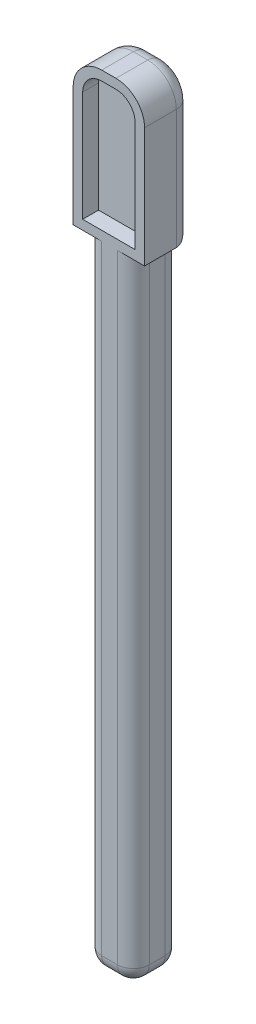
ISO-10303-21;
HEADER;
FILE_DESCRIPTION(('STEP AP214'),'2;1');
FILE_NAME('part.step','',(''),(''),'','','');
FILE_SCHEMA(('AUTOMOTIVE_DESIGN { 1 0 10303 214 1 1 1 1 }'));
ENDSEC;
DATA;
#1=APPLICATION_CONTEXT('core data for automotive mechanical design processes');
#2=APPLICATION_PROTOCOL_DEFINITION('international standard','automotive_design',2000,#1);
#3=PRODUCT_CONTEXT('',#1,'mechanical');
#4=PRODUCT('Part','Part','',(#3));
#5=PRODUCT_RELATED_PRODUCT_CATEGORY('part','',(#4));
#6=PRODUCT_DEFINITION_FORMATION('','',#4);
#7=PRODUCT_DEFINITION_CONTEXT('part definition',#1,'design');
#8=PRODUCT_DEFINITION('design','',#6,#7);
#9=PRODUCT_DEFINITION_SHAPE('','',#8);
#10=(LENGTH_UNIT() NAMED_UNIT(*) SI_UNIT(.MILLI.,.METRE.));
#11=(NAMED_UNIT(*) PLANE_ANGLE_UNIT() SI_UNIT($,.RADIAN.));
#12=(NAMED_UNIT(*) SI_UNIT($,.STERADIAN.) SOLID_ANGLE_UNIT());
#13=UNCERTAINTY_MEASURE_WITH_UNIT(LENGTH_MEASURE(1.E-05),#10,'distance_accuracy_value','');
#14=(GEOMETRIC_REPRESENTATION_CONTEXT(3) GLOBAL_UNCERTAINTY_ASSIGNED_CONTEXT((#13)) GLOBAL_UNIT_ASSIGNED_CONTEXT((#10,
#11,#12)) REPRESENTATION_CONTEXT('',''));
#15=CARTESIAN_POINT('',(0.,0.,0.));
#16=DIRECTION('',(0.,0.,1.));
#17=DIRECTION('',(1.,0.,0.));
#18=AXIS2_PLACEMENT_3D('',#15,#16,#17);
#19=CARTESIAN_POINT('',(0.,0.,3.));
#20=DIRECTION('',(1.,0.,0.));
#21=DIRECTION('',(0.,0.,-1.));
#22=AXIS2_PLACEMENT_3D('',#19,#20,#21);
#23=PLANE('',#22);
#24=DIRECTION('',(0.,0.,-1.));
#25=VECTOR('',#24,1.);
#26=CARTESIAN_POINT('',(0.,0.999999999999999,3.));
#27=LINE('',#26,#25);
#28=CARTESIAN_POINT('',(0.,0.999999999999999,0.999999999999999));
#29=VERTEX_POINT('',#28);
#30=CARTESIAN_POINT('',(0.,0.999999999999999,2.));
#31=VERTEX_POINT('',#30);
#32=EDGE_CURVE('E317',#29,#31,#27,.F.);
#33=ORIENTED_EDGE('',*,*,#32,.T.);
#34=DIRECTION('',(0.,-1.,0.));
#35=VECTOR('',#34,1.);
#36=CARTESIAN_POINT('',(0.,40.,2.));
#37=LINE('',#36,#35);
#38=CARTESIAN_POINT('',(0.,40.,2.));
#39=VERTEX_POINT('',#38);
#40=EDGE_CURVE('E319',#31,#39,#37,.F.);
#41=ORIENTED_EDGE('',*,*,#40,.T.);
#42=DIRECTION('',(0.,0.,-1.));
#43=VECTOR('',#42,1.);
#44=CARTESIAN_POINT('',(0.,40.,3.));
#45=LINE('',#44,#43);
#46=CARTESIAN_POINT('',(0.,40.,0.999999999999999));
#47=VERTEX_POINT('',#46);
#48=EDGE_CURVE('E278',#39,#47,#45,.T.);
#49=ORIENTED_EDGE('',*,*,#48,.T.);
#50=DIRECTION('',(0.,-1.,0.));
#51=VECTOR('',#50,1.);
#52=CARTESIAN_POINT('',(0.,0.,0.999999999999999));
#53=LINE('',#52,#51);
#54=EDGE_CURVE('E315',#47,#29,#53,.T.);
#55=ORIENTED_EDGE('',*,*,#54,.T.);
#56=EDGE_LOOP('',(#33,#41,#49,#55));
#57=FACE_BOUND('',#56,.T.);
#58=ADVANCED_FACE('F35',(#57),#23,.F.);
#59=CARTESIAN_POINT('',(0.,0.,3.));
#60=DIRECTION('',(0.,1.,0.));
#61=DIRECTION('',(0.,0.,1.));
#62=AXIS2_PLACEMENT_3D('',#59,#60,#61);
#63=PLANE('',#62);
#64=DIRECTION('',(0.,0.,-1.));
#65=VECTOR('',#64,1.);
#66=CARTESIAN_POINT('',(2.,0.,3.));
#67=LINE('',#66,#65);
#68=CARTESIAN_POINT('',(2.,0.,0.999999999999999));
#69=VERTEX_POINT('',#68);
#70=CARTESIAN_POINT('',(2.,0.,2.));
#71=VERTEX_POINT('',#70);
#72=EDGE_CURVE('E310',#69,#71,#67,.F.);
#73=ORIENTED_EDGE('',*,*,#72,.T.);
#74=DIRECTION('',(1.,0.,0.));
#75=VECTOR('',#74,1.);
#76=CARTESIAN_POINT('',(0.,0.,2.));
#77=LINE('',#76,#75);
#78=CARTESIAN_POINT('',(0.999999999999999,0.,2.));
#79=VERTEX_POINT('',#78);
#80=EDGE_CURVE('E313',#71,#79,#77,.F.);
#81=ORIENTED_EDGE('',*,*,#80,.T.);
#82=DIRECTION('',(0.,0.,-1.));
#83=VECTOR('',#82,1.);
#84=CARTESIAN_POINT('',(0.999999999999999,0.,3.));
#85=LINE('',#84,#83);
#86=CARTESIAN_POINT('',(0.999999999999999,0.,0.999999999999999));
#87=VERTEX_POINT('',#86);
#88=EDGE_CURVE('E308',#79,#87,#85,.T.);
#89=ORIENTED_EDGE('',*,*,#88,.T.);
#90=DIRECTION('',(1.,0.,0.));
#91=VECTOR('',#90,1.);
#92=CARTESIAN_POINT('',(0.,0.,0.999999999999999));
#93=LINE('',#92,#91);
#94=EDGE_CURVE('E306',#87,#69,#93,.T.);
#95=ORIENTED_EDGE('',*,*,#94,.T.);
#96=EDGE_LOOP('',(#73,#81,#89,#95));
#97=FACE_BOUND('',#96,.T.);
#98=ADVANCED_FACE('F524',(#97),#63,.F.);
#99=CARTESIAN_POINT('',(3.,0.,3.));
#100=DIRECTION('',(-1.,0.,0.));
#101=DIRECTION('',(0.,0.,1.));
#102=AXIS2_PLACEMENT_3D('',#99,#100,#101);
#103=PLANE('',#102);
#104=DIRECTION('',(0.,0.,-1.));
#105=VECTOR('',#104,1.);
#106=CARTESIAN_POINT('',(3.,40.,3.));
#107=LINE('',#106,#105);
#108=CARTESIAN_POINT('',(3.,40.,2.));
#109=VERTEX_POINT('',#108);
#110=CARTESIAN_POINT('',(3.,40.,0.999999999999999));
#111=VERTEX_POINT('',#110);
#112=EDGE_CURVE('E296',#109,#111,#107,.T.);
#113=ORIENTED_EDGE('',*,*,#112,.F.);
#114=DIRECTION('',(0.,1.,0.));
#115=VECTOR('',#114,1.);
#116=CARTESIAN_POINT('',(3.,0.,2.));
#117=LINE('',#116,#115);
#118=CARTESIAN_POINT('',(3.,0.999999999999999,2.));
#119=VERTEX_POINT('',#118);
#120=EDGE_CURVE('E304',#109,#119,#117,.F.);
#121=ORIENTED_EDGE('',*,*,#120,.T.);
#122=DIRECTION('',(0.,0.,-1.));
#123=VECTOR('',#122,1.);
#124=CARTESIAN_POINT('',(3.,0.999999999999999,3.));
#125=LINE('',#124,#123);
#126=CARTESIAN_POINT('',(3.,0.999999999999999,0.999999999999999));
#127=VERTEX_POINT('',#126);
#128=EDGE_CURVE('E301',#119,#127,#125,.T.);
#129=ORIENTED_EDGE('',*,*,#128,.T.);
#130=DIRECTION('',(0.,1.,0.));
#131=VECTOR('',#130,1.);
#132=CARTESIAN_POINT('',(3.,0.,0.999999999999999));
#133=LINE('',#132,#131);
#134=EDGE_CURVE('E299',#127,#111,#133,.T.);
#135=ORIENTED_EDGE('',*,*,#134,.T.);
#136=EDGE_LOOP('',(#113,#121,#129,#135));
#137=FACE_BOUND('',#136,.T.);
#138=ADVANCED_FACE('F505',(#137),#103,.F.);
#139=CARTESIAN_POINT('',(3.,40.,3.));
#140=DIRECTION('',(0.,1.,0.));
#141=DIRECTION('',(0.,0.,1.));
#142=AXIS2_PLACEMENT_3D('',#139,#140,#141);
#143=PLANE('',#142);
#144=ORIENTED_EDGE('',*,*,#112,.T.);
#145=DIRECTION('',(1.,0.,0.));
#146=VECTOR('',#145,1.);
#147=CARTESIAN_POINT('',(3.,40.,0.999999999999999));
#148=LINE('',#147,#146);
#149=CARTESIAN_POINT('',(3.70308990164131,40.,0.999999999999999));
#150=VERTEX_POINT('',#149);
#151=EDGE_CURVE('E349',#111,#150,#148,.T.);
#152=ORIENTED_EDGE('',*,*,#151,.T.);
#153=DIRECTION('',(0.,0.,-1.));
#154=VECTOR('',#153,1.);
#155=CARTESIAN_POINT('',(3.70308990164131,40.,3.));
#156=LINE('',#155,#154);
#157=CARTESIAN_POINT('',(3.70308990164131,40.,3.));
#158=VERTEX_POINT('',#157);
#159=EDGE_CURVE('E294',#158,#150,#156,.T.);
#160=ORIENTED_EDGE('',*,*,#159,.F.);
#161=DIRECTION('',(1.,0.,0.));
#162=VECTOR('',#161,1.);
#163=CARTESIAN_POINT('',(3.,40.,3.));
#164=LINE('',#163,#162);
#165=CARTESIAN_POINT('',(2.,40.,3.));
#166=VERTEX_POINT('',#165);
#167=EDGE_CURVE('E257',#166,#158,#164,.T.);
#168=ORIENTED_EDGE('',*,*,#167,.F.);
#169=CARTESIAN_POINT('',(2.,40.,2.));
#170=DIRECTION('',(0.,1.,0.));
#171=DIRECTION('',(0.,0.,1.));
#172=AXIS2_PLACEMENT_3D('',#169,#170,#171);
#173=CIRCLE('',#172,0.999999999999999);
#174=EDGE_CURVE('E11',#166,#109,#173,.T.);
#175=ORIENTED_EDGE('',*,*,#174,.T.);
#176=EDGE_LOOP('',(#144,#152,#160,#168,#175));
#177=FACE_BOUND('',#176,.T.);
#178=ADVANCED_FACE('F501',(#177),#143,.F.);
#179=CARTESIAN_POINT('',(3.70308990164131,40.,3.));
#180=DIRECTION('',(-1.,0.,0.));
#181=DIRECTION('',(0.,0.,1.));
#182=AXIS2_PLACEMENT_3D('',#179,#180,#181);
#183=PLANE('',#182);
#184=ORIENTED_EDGE('',*,*,#159,.T.);
#185=DIRECTION('',(0.,1.,0.));
#186=VECTOR('',#185,1.);
#187=CARTESIAN_POINT('',(3.70308990164131,40.,0.999999999999999));
#188=LINE('',#187,#186);
#189=CARTESIAN_POINT('',(3.70308990164131,47.5461538461538,0.999999999999999));
#190=VERTEX_POINT('',#189);
#191=EDGE_CURVE('E52',#150,#190,#188,.T.);
#192=ORIENTED_EDGE('',*,*,#191,.T.);
#193=DIRECTION('',(0.,0.,-1.));
#194=VECTOR('',#193,1.);
#195=CARTESIAN_POINT('',(3.70308990164131,47.5461538461538,3.));
#196=LINE('',#195,#194);
#197=CARTESIAN_POINT('',(3.70308990164131,47.5461538461538,3.));
#198=VERTEX_POINT('',#197);
#199=EDGE_CURVE('E292',#198,#190,#196,.T.);
#200=ORIENTED_EDGE('',*,*,#199,.F.);
#201=DIRECTION('',(0.,1.,0.));
#202=VECTOR('',#201,1.);
#203=CARTESIAN_POINT('',(3.70308990164131,40.,3.));
#204=LINE('',#203,#202);
#205=EDGE_CURVE('E266',#158,#198,#204,.T.);
#206=ORIENTED_EDGE('',*,*,#205,.F.);
#207=EDGE_LOOP('',(#184,#192,#200,#206));
#208=FACE_BOUND('',#207,.T.);
#209=ADVANCED_FACE('F514',(#208),#183,.F.);
#210=CARTESIAN_POINT('',(1.90308990164131,47.5461538461538,3.));
#211=DIRECTION('',(0.,0.,-1.));
#212=DIRECTION('',(-1.,0.,0.));
#213=AXIS2_PLACEMENT_3D('',#210,#211,#212);
#214=CYLINDRICAL_SURFACE('',#213,1.8);
#215=ORIENTED_EDGE('',*,*,#199,.T.);
#216=CARTESIAN_POINT('',(1.90308990164131,47.5461538461538,0.999999999999999));
#217=DIRECTION('',(0.,0.,1.));
#218=DIRECTION('',(1.,0.,0.));
#219=AXIS2_PLACEMENT_3D('',#216,#217,#218);
#220=CIRCLE('',#219,1.8);
#221=CARTESIAN_POINT('',(1.90308990164131,49.3461538461538,0.999999999999999));
#222=VERTEX_POINT('',#221);
#223=EDGE_CURVE('E59',#190,#222,#220,.T.);
#224=ORIENTED_EDGE('',*,*,#223,.T.);
#225=DIRECTION('',(0.,0.,-1.));
#226=VECTOR('',#225,1.);
#227=CARTESIAN_POINT('',(1.90308990164131,49.3461538461538,3.));
#228=LINE('',#227,#226);
#229=CARTESIAN_POINT('',(1.90308990164131,49.3461538461538,3.));
#230=VERTEX_POINT('',#229);
#231=EDGE_CURVE('E290',#230,#222,#228,.T.);
#232=ORIENTED_EDGE('',*,*,#231,.F.);
#233=CARTESIAN_POINT('',(1.90308990164131,47.5461538461538,3.));
#234=DIRECTION('',(0.,0.,1.));
#235=DIRECTION('',(-1.,0.,0.));
#236=AXIS2_PLACEMENT_3D('',#233,#234,#235);
#237=CIRCLE('',#236,1.8);
#238=EDGE_CURVE('E268',#198,#230,#237,.T.);
#239=ORIENTED_EDGE('',*,*,#238,.F.);
#240=EDGE_LOOP('',(#215,#224,#232,#239));
#241=FACE_BOUND('',#240,.T.);
#242=ADVANCED_FACE('F445',(#241),#214,.T.);
#243=CARTESIAN_POINT('',(1.00308990164131,49.3461538461538,3.));
#244=DIRECTION('',(0.,-1.,0.));
#245=DIRECTION('',(0.,0.,-1.));
#246=AXIS2_PLACEMENT_3D('',#243,#244,#245);
#247=PLANE('',#246);
#248=ORIENTED_EDGE('',*,*,#231,.T.);
#249=DIRECTION('',(-1.,0.,0.));
#250=VECTOR('',#249,1.);
#251=CARTESIAN_POINT('',(1.00308990164131,49.3461538461538,0.999999999999999));
#252=LINE('',#251,#250);
#253=CARTESIAN_POINT('',(1.00308990164131,49.3461538461538,0.999999999999999));
#254=VERTEX_POINT('',#253);
#255=EDGE_CURVE('E355',#222,#254,#252,.T.);
#256=ORIENTED_EDGE('',*,*,#255,.T.);
#257=DIRECTION('',(0.,0.,-1.));
#258=VECTOR('',#257,1.);
#259=CARTESIAN_POINT('',(1.00308990164131,49.3461538461538,3.));
#260=LINE('',#259,#258);
#261=CARTESIAN_POINT('',(1.00308990164131,49.3461538461538,3.));
#262=VERTEX_POINT('',#261);
#263=EDGE_CURVE('E287',#262,#254,#260,.T.);
#264=ORIENTED_EDGE('',*,*,#263,.F.);
#265=DIRECTION('',(-1.,0.,0.));
#266=VECTOR('',#265,1.);
#267=CARTESIAN_POINT('',(1.00308990164131,49.3461538461538,3.));
#268=LINE('',#267,#266);
#269=EDGE_CURVE('E270',#230,#262,#268,.T.);
#270=ORIENTED_EDGE('',*,*,#269,.F.);
#271=EDGE_LOOP('',(#248,#256,#264,#270));
#272=FACE_BOUND('',#271,.T.);
#273=ADVANCED_FACE('F444',(#272),#247,.F.);
#274=CARTESIAN_POINT('',(1.00308990164131,47.5461538461538,3.));
#275=DIRECTION('',(0.,0.,-1.));
#276=DIRECTION('',(-1.,0.,0.));
#277=AXIS2_PLACEMENT_3D('',#274,#275,#276);
#278=CYLINDRICAL_SURFACE('',#277,1.8);
#279=ORIENTED_EDGE('',*,*,#263,.T.);
#280=CARTESIAN_POINT('',(1.00308990164131,47.5461538461538,0.999999999999999));
#281=DIRECTION('',(0.,0.,1.));
#282=DIRECTION('',(1.,0.,0.));
#283=AXIS2_PLACEMENT_3D('',#280,#281,#282);
#284=CIRCLE('',#283,1.8);
#285=CARTESIAN_POINT('',(-0.796910098358696,47.5461538461538,0.999999999999999));
#286=VERTEX_POINT('',#285);
#287=EDGE_CURVE('E357',#254,#286,#284,.T.);
#288=ORIENTED_EDGE('',*,*,#287,.T.);
#289=DIRECTION('',(0.,0.,-1.));
#290=VECTOR('',#289,1.);
#291=CARTESIAN_POINT('',(-0.796910098358696,47.5461538461538,3.));
#292=LINE('',#291,#290);
#293=CARTESIAN_POINT('',(-0.796910098358696,47.5461538461538,3.));
#294=VERTEX_POINT('',#293);
#295=EDGE_CURVE('E284',#294,#286,#292,.T.);
#296=ORIENTED_EDGE('',*,*,#295,.F.);
#297=CARTESIAN_POINT('',(1.00308990164131,47.5461538461538,3.));
#298=DIRECTION('',(0.,0.,1.));
#299=DIRECTION('',(1.,0.,0.));
#300=AXIS2_PLACEMENT_3D('',#297,#298,#299);
#301=CIRCLE('',#300,1.8);
#302=EDGE_CURVE('E272',#262,#294,#301,.T.);
#303=ORIENTED_EDGE('',*,*,#302,.F.);
#304=EDGE_LOOP('',(#279,#288,#296,#303));
#305=FACE_BOUND('',#304,.T.);
#306=ADVANCED_FACE('F431',(#305),#278,.T.);
#307=CARTESIAN_POINT('',(-0.796910098358694,40.,3.));
#308=DIRECTION('',(1.,0.,0.));
#309=DIRECTION('',(0.,0.,-1.));
#310=AXIS2_PLACEMENT_3D('',#307,#308,#309);
#311=PLANE('',#310);
#312=ORIENTED_EDGE('',*,*,#295,.T.);
#313=DIRECTION('',(0.,-1.,0.));
#314=VECTOR('',#313,1.);
#315=CARTESIAN_POINT('',(-0.796910098358694,40.,0.999999999999999));
#316=LINE('',#315,#314);
#317=CARTESIAN_POINT('',(-0.796910098358694,40.,0.999999999999999));
#318=VERTEX_POINT('',#317);
#319=EDGE_CURVE('E353',#286,#318,#316,.T.);
#320=ORIENTED_EDGE('',*,*,#319,.T.);
#321=DIRECTION('',(0.,0.,-1.));
#322=VECTOR('',#321,1.);
#323=CARTESIAN_POINT('',(-0.796910098358694,40.,3.));
#324=LINE('',#323,#322);
#325=CARTESIAN_POINT('',(-0.796910098358694,40.,3.));
#326=VERTEX_POINT('',#325);
#327=EDGE_CURVE('E281',#326,#318,#324,.T.);
#328=ORIENTED_EDGE('',*,*,#327,.F.);
#329=DIRECTION('',(0.,-1.,0.));
#330=VECTOR('',#329,1.);
#331=CARTESIAN_POINT('',(-0.796910098358694,40.,3.));
#332=LINE('',#331,#330);
#333=EDGE_CURVE('E274',#294,#326,#332,.T.);
#334=ORIENTED_EDGE('',*,*,#333,.F.);
#335=EDGE_LOOP('',(#312,#320,#328,#334));
#336=FACE_BOUND('',#335,.T.);
#337=ADVANCED_FACE('F436',(#336),#311,.F.);
#338=CARTESIAN_POINT('',(-0.796910098358694,40.,3.));
#339=DIRECTION('',(0.,1.,0.));
#340=DIRECTION('',(0.,0.,1.));
#341=AXIS2_PLACEMENT_3D('',#338,#339,#340);
#342=PLANE('',#341);
#343=ORIENTED_EDGE('',*,*,#327,.T.);
#344=DIRECTION('',(1.,0.,0.));
#345=VECTOR('',#344,1.);
#346=CARTESIAN_POINT('',(-0.796910098358694,40.,0.999999999999999));
#347=LINE('',#346,#345);
#348=EDGE_CURVE('E351',#318,#47,#347,.T.);
#349=ORIENTED_EDGE('',*,*,#348,.T.);
#350=ORIENTED_EDGE('',*,*,#48,.F.);
#351=CARTESIAN_POINT('',(0.999999999999999,40.,2.));
#352=DIRECTION('',(0.,1.,0.));
#353=DIRECTION('',(0.,0.,1.));
#354=AXIS2_PLACEMENT_3D('',#351,#352,#353);
#355=CIRCLE('',#354,0.999999999999999);
#356=CARTESIAN_POINT('',(0.999999999999999,40.,3.));
#357=VERTEX_POINT('',#356);
#358=EDGE_CURVE('E44',#39,#357,#355,.T.);
#359=ORIENTED_EDGE('',*,*,#358,.T.);
#360=DIRECTION('',(1.,0.,0.));
#361=VECTOR('',#360,1.);
#362=CARTESIAN_POINT('',(-0.796910098358694,40.,3.));
#363=LINE('',#362,#361);
#364=EDGE_CURVE('E276',#326,#357,#363,.T.);
#365=ORIENTED_EDGE('',*,*,#364,.F.);
#366=EDGE_LOOP('',(#343,#349,#350,#359,#365));
#367=FACE_BOUND('',#366,.T.);
#368=ADVANCED_FACE('F469',(#367),#342,.F.);
#369=CARTESIAN_POINT('',(1.00308990164131,47.5461538461538,3.));
#370=DIRECTION('',(0.,0.,1.));
#371=DIRECTION('',(1.,0.,0.));
#372=AXIS2_PLACEMENT_3D('',#369,#370,#371);
#373=PLANE('',#372);
#374=DIRECTION('',(1.,0.,0.));
#375=VECTOR('',#374,1.);
#376=CARTESIAN_POINT('',(-0.196910098358695,40.6,3.));
#377=LINE('',#376,#375);
#378=CARTESIAN_POINT('',(-0.196910098358695,40.6,3.));
#379=VERTEX_POINT('',#378);
#380=CARTESIAN_POINT('',(3.10308990164131,40.6,3.));
#381=VERTEX_POINT('',#380);
#382=EDGE_CURVE('E213',#379,#381,#377,.T.);
#383=ORIENTED_EDGE('',*,*,#382,.F.);
#384=DIRECTION('',(0.,-1.,0.));
#385=VECTOR('',#384,1.);
#386=CARTESIAN_POINT('',(-0.196910098358696,47.5461538461538,3.));
#387=LINE('',#386,#385);
#388=CARTESIAN_POINT('',(-0.196910098358695,47.5461538461538,3.));
#389=VERTEX_POINT('',#388);
#390=EDGE_CURVE('E231',#389,#379,#387,.T.);
#391=ORIENTED_EDGE('',*,*,#390,.F.);
#392=CARTESIAN_POINT('',(1.00308990164131,47.5461538461538,3.));
#393=DIRECTION('',(0.,0.,1.));
#394=DIRECTION('',(1.,0.,0.));
#395=AXIS2_PLACEMENT_3D('',#392,#393,#394);
#396=CIRCLE('',#395,1.2);
#397=CARTESIAN_POINT('',(1.00308990164131,48.7461538461538,3.));
#398=VERTEX_POINT('',#397);
#399=EDGE_CURVE('E234',#398,#389,#396,.T.);
#400=ORIENTED_EDGE('',*,*,#399,.F.);
#401=DIRECTION('',(-1.,0.,0.));
#402=VECTOR('',#401,1.);
#403=CARTESIAN_POINT('',(1.90308990164131,48.7461538461538,3.));
#404=LINE('',#403,#402);
#405=CARTESIAN_POINT('',(1.90308990164131,48.7461538461538,3.));
#406=VERTEX_POINT('',#405);
#407=EDGE_CURVE('E250',#406,#398,#404,.T.);
#408=ORIENTED_EDGE('',*,*,#407,.F.);
#409=CARTESIAN_POINT('',(1.90308990164131,47.5461538461538,3.));
#410=DIRECTION('',(0.,0.,1.));
#411=DIRECTION('',(1.,0.,0.));
#412=AXIS2_PLACEMENT_3D('',#409,#410,#411);
#413=CIRCLE('',#412,1.2);
#414=CARTESIAN_POINT('',(3.10308990164131,47.5461538461538,3.));
#415=VERTEX_POINT('',#414);
#416=EDGE_CURVE('E247',#415,#406,#413,.T.);
#417=ORIENTED_EDGE('',*,*,#416,.F.);
#418=DIRECTION('',(0.,1.,0.));
#419=VECTOR('',#418,1.);
#420=CARTESIAN_POINT('',(3.10308990164131,40.6,3.));
#421=LINE('',#420,#419);
#422=EDGE_CURVE('E245',#381,#415,#421,.T.);
#423=ORIENTED_EDGE('',*,*,#422,.F.);
#424=EDGE_LOOP('',(#383,#391,#400,#408,#417,#423));
#425=FACE_BOUND('',#424,.T.);
#426=ORIENTED_EDGE('',*,*,#364,.T.);
#427=DIRECTION('',(0.,-1.,0.));
#428=VECTOR('',#427,1.);
#429=CARTESIAN_POINT('',(0.999999999999999,0.,3.));
#430=LINE('',#429,#428);
#431=CARTESIAN_POINT('',(0.999999999999999,1.,3.));
#432=VERTEX_POINT('',#431);
#433=EDGE_CURVE('E326',#357,#432,#430,.T.);
#434=ORIENTED_EDGE('',*,*,#433,.T.);
#435=DIRECTION('',(1.,0.,0.));
#436=VECTOR('',#435,1.);
#437=CARTESIAN_POINT('',(3.,1.,3.));
#438=LINE('',#437,#436);
#439=CARTESIAN_POINT('',(2.,1.,3.));
#440=VERTEX_POINT('',#439);
#441=EDGE_CURVE('E324',#432,#440,#438,.T.);
#442=ORIENTED_EDGE('',*,*,#441,.T.);
#443=DIRECTION('',(0.,1.,0.));
#444=VECTOR('',#443,1.);
#445=CARTESIAN_POINT('',(2.,40.,3.));
#446=LINE('',#445,#444);
#447=EDGE_CURVE('E321',#440,#166,#446,.T.);
#448=ORIENTED_EDGE('',*,*,#447,.T.);
#449=ORIENTED_EDGE('',*,*,#167,.T.);
#450=ORIENTED_EDGE('',*,*,#205,.T.);
#451=ORIENTED_EDGE('',*,*,#238,.T.);
#452=ORIENTED_EDGE('',*,*,#269,.T.);
#453=ORIENTED_EDGE('',*,*,#302,.T.);
#454=ORIENTED_EDGE('',*,*,#333,.T.);
#455=EDGE_LOOP('',(#426,#434,#442,#448,#449,#450,#451,#452,#453,#454));
#456=FACE_BOUND('',#455,.T.);
#457=ADVANCED_FACE('F440',(#425,#456),#373,.T.);
#458=CARTESIAN_POINT('',(1.00308990164131,47.5461538461538,0.));
#459=DIRECTION('',(0.,0.,1.));
#460=DIRECTION('',(1.,0.,0.));
#461=AXIS2_PLACEMENT_3D('',#458,#459,#460);
#462=PLANE('',#461);
#463=DIRECTION('',(1.,0.,0.));
#464=VECTOR('',#463,1.);
#465=CARTESIAN_POINT('',(1.00308990164131,41.,0.));
#466=LINE('',#465,#464);
#467=CARTESIAN_POINT('',(0.999999999999999,41.,0.));
#468=VERTEX_POINT('',#467);
#469=CARTESIAN_POINT('',(0.203089901641305,41.,0.));
#470=VERTEX_POINT('',#469);
#471=EDGE_CURVE('E343',#468,#470,#466,.F.);
#472=ORIENTED_EDGE('',*,*,#471,.T.);
#473=DIRECTION('',(0.,-1.,0.));
#474=VECTOR('',#473,1.);
#475=CARTESIAN_POINT('',(0.203089901641305,47.5461538461538,0.));
#476=LINE('',#475,#474);
#477=CARTESIAN_POINT('',(0.203089901641304,47.5461538461538,0.));
#478=VERTEX_POINT('',#477);
#479=EDGE_CURVE('E347',#470,#478,#476,.F.);
#480=ORIENTED_EDGE('',*,*,#479,.T.);
#481=CARTESIAN_POINT('',(1.00308990164131,47.5461538461538,0.));
#482=DIRECTION('',(0.,0.,1.));
#483=DIRECTION('',(1.,0.,0.));
#484=AXIS2_PLACEMENT_3D('',#481,#482,#483);
#485=CIRCLE('',#484,0.800000000000002);
#486=CARTESIAN_POINT('',(1.00308990164131,48.3461538461538,0.));
#487=VERTEX_POINT('',#486);
#488=EDGE_CURVE('E345',#478,#487,#485,.F.);
#489=ORIENTED_EDGE('',*,*,#488,.T.);
#490=DIRECTION('',(-1.,0.,0.));
#491=VECTOR('',#490,1.);
#492=CARTESIAN_POINT('',(1.00308990164131,48.3461538461538,0.));
#493=LINE('',#492,#491);
#494=CARTESIAN_POINT('',(1.90308990164131,48.3461538461538,0.));
#495=VERTEX_POINT('',#494);
#496=EDGE_CURVE('E339',#487,#495,#493,.F.);
#497=ORIENTED_EDGE('',*,*,#496,.T.);
#498=CARTESIAN_POINT('',(1.90308990164131,47.5461538461538,0.));
#499=DIRECTION('',(0.,0.,1.));
#500=DIRECTION('',(1.,0.,0.));
#501=AXIS2_PLACEMENT_3D('',#498,#499,#500);
#502=CIRCLE('',#501,0.800000000000002);
#503=CARTESIAN_POINT('',(2.70308990164131,47.5461538461538,0.));
#504=VERTEX_POINT('',#503);
#505=EDGE_CURVE('E337',#495,#504,#502,.F.);
#506=ORIENTED_EDGE('',*,*,#505,.T.);
#507=DIRECTION('',(0.,1.,0.));
#508=VECTOR('',#507,1.);
#509=CARTESIAN_POINT('',(2.70308990164131,47.5461538461538,0.));
#510=LINE('',#509,#508);
#511=CARTESIAN_POINT('',(2.70308990164131,41.,0.));
#512=VERTEX_POINT('',#511);
#513=EDGE_CURVE('E335',#504,#512,#510,.F.);
#514=ORIENTED_EDGE('',*,*,#513,.T.);
#515=DIRECTION('',(1.,0.,0.));
#516=VECTOR('',#515,1.);
#517=CARTESIAN_POINT('',(1.00308990164131,41.,0.));
#518=LINE('',#517,#516);
#519=CARTESIAN_POINT('',(2.,41.,0.));
#520=VERTEX_POINT('',#519);
#521=EDGE_CURVE('E330',#512,#520,#518,.F.);
#522=ORIENTED_EDGE('',*,*,#521,.T.);
#523=DIRECTION('',(0.,1.,0.));
#524=VECTOR('',#523,1.);
#525=CARTESIAN_POINT('',(2.,47.5461538461538,0.));
#526=LINE('',#525,#524);
#527=CARTESIAN_POINT('',(2.,0.999999999999999,0.));
#528=VERTEX_POINT('',#527);
#529=EDGE_CURVE('E328',#520,#528,#526,.F.);
#530=ORIENTED_EDGE('',*,*,#529,.T.);
#531=DIRECTION('',(1.,0.,0.));
#532=VECTOR('',#531,1.);
#533=CARTESIAN_POINT('',(1.00308990164131,1.,0.));
#534=LINE('',#533,#532);
#535=CARTESIAN_POINT('',(0.999999999999999,0.999999999999999,0.));
#536=VERTEX_POINT('',#535);
#537=EDGE_CURVE('E332',#528,#536,#534,.F.);
#538=ORIENTED_EDGE('',*,*,#537,.T.);
#539=DIRECTION('',(0.,-1.,0.));
#540=VECTOR('',#539,1.);
#541=CARTESIAN_POINT('',(0.999999999999999,47.5461538461538,0.));
#542=LINE('',#541,#540);
#543=EDGE_CURVE('E341',#536,#468,#542,.F.);
#544=ORIENTED_EDGE('',*,*,#543,.T.);
#545=EDGE_LOOP('',(#472,#480,#489,#497,#506,#514,#522,#530,#538,#544));
#546=FACE_BOUND('',#545,.T.);
#547=ADVANCED_FACE('F457',(#546),#462,.F.);
#548=CARTESIAN_POINT('',(-0.196910098358695,40.6,2.));
#549=DIRECTION('',(0.,-1.,0.));
#550=DIRECTION('',(0.,0.,-1.));
#551=AXIS2_PLACEMENT_3D('',#548,#549,#550);
#552=PLANE('',#551);
#553=ORIENTED_EDGE('',*,*,#382,.T.);
#554=DIRECTION('',(0.,0.,1.));
#555=VECTOR('',#554,1.);
#556=CARTESIAN_POINT('',(3.10308990164131,40.6,2.));
#557=LINE('',#556,#555);
#558=CARTESIAN_POINT('',(3.10308990164131,40.6,2.));
#559=VERTEX_POINT('',#558);
#560=EDGE_CURVE('E206',#559,#381,#557,.T.);
#561=ORIENTED_EDGE('',*,*,#560,.F.);
#562=DIRECTION('',(1.,0.,0.));
#563=VECTOR('',#562,1.);
#564=CARTESIAN_POINT('',(-0.196910098358695,40.6,2.));
#565=LINE('',#564,#563);
#566=CARTESIAN_POINT('',(-0.196910098358695,40.6,2.));
#567=VERTEX_POINT('',#566);
#568=EDGE_CURVE('E210',#567,#559,#565,.T.);
#569=ORIENTED_EDGE('',*,*,#568,.F.);
#570=DIRECTION('',(0.,0.,1.));
#571=VECTOR('',#570,1.);
#572=CARTESIAN_POINT('',(-0.196910098358695,40.6,2.));
#573=LINE('',#572,#571);
#574=EDGE_CURVE('E255',#567,#379,#573,.T.);
#575=ORIENTED_EDGE('',*,*,#574,.T.);
#576=EDGE_LOOP('',(#553,#561,#569,#575));
#577=FACE_BOUND('',#576,.T.);
#578=ADVANCED_FACE('F208',(#577),#552,.F.);
#579=CARTESIAN_POINT('',(-0.196910098358696,47.5461538461538,2.));
#580=DIRECTION('',(-1.,0.,0.));
#581=DIRECTION('',(0.,-1.,0.));
#582=AXIS2_PLACEMENT_3D('',#579,#580,#581);
#583=PLANE('',#582);
#584=ORIENTED_EDGE('',*,*,#390,.T.);
#585=ORIENTED_EDGE('',*,*,#574,.F.);
#586=DIRECTION('',(0.,-1.,0.));
#587=VECTOR('',#586,1.);
#588=CARTESIAN_POINT('',(-0.196910098358696,47.5461538461538,2.));
#589=LINE('',#588,#587);
#590=CARTESIAN_POINT('',(-0.196910098358695,47.5461538461538,2.));
#591=VERTEX_POINT('',#590);
#592=EDGE_CURVE('E218',#591,#567,#589,.T.);
#593=ORIENTED_EDGE('',*,*,#592,.F.);
#594=DIRECTION('',(0.,0.,1.));
#595=VECTOR('',#594,1.);
#596=CARTESIAN_POINT('',(-0.196910098358695,47.5461538461538,2.));
#597=LINE('',#596,#595);
#598=EDGE_CURVE('E258',#591,#389,#597,.T.);
#599=ORIENTED_EDGE('',*,*,#598,.T.);
#600=EDGE_LOOP('',(#584,#585,#593,#599));
#601=FACE_BOUND('',#600,.T.);
#602=ADVANCED_FACE('F592',(#601),#583,.F.);
#603=CARTESIAN_POINT('',(1.00308990164131,47.5461538461538,2.));
#604=DIRECTION('',(0.,0.,1.));
#605=DIRECTION('',(1.,0.,0.));
#606=AXIS2_PLACEMENT_3D('',#603,#604,#605);
#607=CYLINDRICAL_SURFACE('',#606,1.2);
#608=ORIENTED_EDGE('',*,*,#399,.T.);
#609=ORIENTED_EDGE('',*,*,#598,.F.);
#610=CARTESIAN_POINT('',(1.00308990164131,47.5461538461538,2.));
#611=DIRECTION('',(0.,0.,1.));
#612=DIRECTION('',(1.,0.,0.));
#613=AXIS2_PLACEMENT_3D('',#610,#611,#612);
#614=CIRCLE('',#613,1.2);
#615=CARTESIAN_POINT('',(1.00308990164131,48.7461538461538,2.));
#616=VERTEX_POINT('',#615);
#617=EDGE_CURVE('E241',#616,#591,#614,.T.);
#618=ORIENTED_EDGE('',*,*,#617,.F.);
#619=DIRECTION('',(0.,0.,1.));
#620=VECTOR('',#619,1.);
#621=CARTESIAN_POINT('',(1.00308990164131,48.7461538461538,2.));
#622=LINE('',#621,#620);
#623=EDGE_CURVE('E260',#616,#398,#622,.T.);
#624=ORIENTED_EDGE('',*,*,#623,.T.);
#625=EDGE_LOOP('',(#608,#609,#618,#624));
#626=FACE_BOUND('',#625,.T.);
#627=ADVANCED_FACE('F595',(#626),#607,.F.);
#628=CARTESIAN_POINT('',(1.90308990164131,48.7461538461538,2.));
#629=DIRECTION('',(0.,1.,0.));
#630=DIRECTION('',(0.,0.,1.));
#631=AXIS2_PLACEMENT_3D('',#628,#629,#630);
#632=PLANE('',#631);
#633=ORIENTED_EDGE('',*,*,#407,.T.);
#634=ORIENTED_EDGE('',*,*,#623,.F.);
#635=DIRECTION('',(-1.,0.,0.));
#636=VECTOR('',#635,1.);
#637=CARTESIAN_POINT('',(1.90308990164131,48.7461538461538,2.));
#638=LINE('',#637,#636);
#639=CARTESIAN_POINT('',(1.90308990164131,48.7461538461538,2.));
#640=VERTEX_POINT('',#639);
#641=EDGE_CURVE('E238',#640,#616,#638,.T.);
#642=ORIENTED_EDGE('',*,*,#641,.F.);
#643=DIRECTION('',(0.,0.,1.));
#644=VECTOR('',#643,1.);
#645=CARTESIAN_POINT('',(1.90308990164131,48.7461538461538,2.));
#646=LINE('',#645,#644);
#647=EDGE_CURVE('E262',#640,#406,#646,.T.);
#648=ORIENTED_EDGE('',*,*,#647,.T.);
#649=EDGE_LOOP('',(#633,#634,#642,#648));
#650=FACE_BOUND('',#649,.T.);
#651=ADVANCED_FACE('F599',(#650),#632,.F.);
#652=CARTESIAN_POINT('',(1.90308990164131,47.5461538461538,2.));
#653=DIRECTION('',(0.,0.,1.));
#654=DIRECTION('',(1.,0.,0.));
#655=AXIS2_PLACEMENT_3D('',#652,#653,#654);
#656=CYLINDRICAL_SURFACE('',#655,1.2);
#657=ORIENTED_EDGE('',*,*,#416,.T.);
#658=ORIENTED_EDGE('',*,*,#647,.F.);
#659=CARTESIAN_POINT('',(1.90308990164131,47.5461538461538,2.));
#660=DIRECTION('',(0.,0.,1.));
#661=DIRECTION('',(1.,0.,0.));
#662=AXIS2_PLACEMENT_3D('',#659,#660,#661);
#663=CIRCLE('',#662,1.2);
#664=CARTESIAN_POINT('',(3.10308990164131,47.5461538461538,2.));
#665=VERTEX_POINT('',#664);
#666=EDGE_CURVE('E226',#665,#640,#663,.T.);
#667=ORIENTED_EDGE('',*,*,#666,.F.);
#668=DIRECTION('',(0.,0.,1.));
#669=VECTOR('',#668,1.);
#670=CARTESIAN_POINT('',(3.10308990164131,47.5461538461538,2.));
#671=LINE('',#670,#669);
#672=EDGE_CURVE('E217',#665,#415,#671,.T.);
#673=ORIENTED_EDGE('',*,*,#672,.T.);
#674=EDGE_LOOP('',(#657,#658,#667,#673));
#675=FACE_BOUND('',#674,.T.);
#676=ADVANCED_FACE('F589',(#675),#656,.F.);
#677=CARTESIAN_POINT('',(3.10308990164131,40.6,2.));
#678=DIRECTION('',(1.,0.,0.));
#679=DIRECTION('',(0.,0.,-1.));
#680=AXIS2_PLACEMENT_3D('',#677,#678,#679);
#681=PLANE('',#680);
#682=ORIENTED_EDGE('',*,*,#422,.T.);
#683=ORIENTED_EDGE('',*,*,#672,.F.);
#684=DIRECTION('',(0.,1.,0.));
#685=VECTOR('',#684,1.);
#686=CARTESIAN_POINT('',(3.10308990164131,40.6,2.));
#687=LINE('',#686,#685);
#688=EDGE_CURVE('E221',#559,#665,#687,.T.);
#689=ORIENTED_EDGE('',*,*,#688,.F.);
#690=ORIENTED_EDGE('',*,*,#560,.T.);
#691=EDGE_LOOP('',(#682,#683,#689,#690));
#692=FACE_BOUND('',#691,.T.);
#693=ADVANCED_FACE('F222',(#692),#681,.F.);
#694=CARTESIAN_POINT('',(1.90308990164131,47.5461538461538,2.));
#695=DIRECTION('',(0.,0.,1.));
#696=DIRECTION('',(1.,0.,0.));
#697=AXIS2_PLACEMENT_3D('',#694,#695,#696);
#698=PLANE('',#697);
#699=ORIENTED_EDGE('',*,*,#568,.T.);
#700=ORIENTED_EDGE('',*,*,#688,.T.);
#701=ORIENTED_EDGE('',*,*,#666,.T.);
#702=ORIENTED_EDGE('',*,*,#641,.T.);
#703=ORIENTED_EDGE('',*,*,#617,.T.);
#704=ORIENTED_EDGE('',*,*,#592,.T.);
#705=EDGE_LOOP('',(#699,#700,#701,#702,#703,#704));
#706=FACE_BOUND('',#705,.T.);
#707=ADVANCED_FACE('F228',(#706),#698,.T.);
#708=CARTESIAN_POINT('',(1.00308990164131,47.5461538461538,0.999999999999999));
#709=DIRECTION('',(0.,0.,1.));
#710=DIRECTION('',(1.,0.,0.));
#711=AXIS2_PLACEMENT_3D('',#708,#709,#710);
#712=DEGENERATE_TOROIDAL_SURFACE('',#711,0.800000000000002,0.999999999999999,.T.);
#713=CARTESIAN_POINT('',(0.203089901641304,47.5461538461538,0.999999999999999));
#714=DIRECTION('',(0.,-1.,0.));
#715=DIRECTION('',(0.,0.,-1.));
#716=AXIS2_PLACEMENT_3D('',#713,#714,#715);
#717=CIRCLE('',#716,0.999999999999999);
#718=EDGE_CURVE('E413',#286,#478,#717,.T.);
#719=ORIENTED_EDGE('',*,*,#718,.F.);
#720=ORIENTED_EDGE('',*,*,#287,.F.);
#721=CARTESIAN_POINT('',(1.00308990164131,48.3461538461538,0.999999999999999));
#722=DIRECTION('',(1.,0.,0.));
#723=DIRECTION('',(0.,0.,-1.));
#724=AXIS2_PLACEMENT_3D('',#721,#722,#723);
#725=CIRCLE('',#724,0.999999999999999);
#726=EDGE_CURVE('E39',#487,#254,#725,.T.);
#727=ORIENTED_EDGE('',*,*,#726,.F.);
#728=ORIENTED_EDGE('',*,*,#488,.F.);
#729=EDGE_LOOP('',(#719,#720,#727,#728));
#730=FACE_BOUND('',#729,.T.);
#731=ADVANCED_FACE('F37',(#730),#712,.T.);
#732=CARTESIAN_POINT('',(1.00308990164131,48.3461538461538,0.999999999999999));
#733=DIRECTION('',(-1.,0.,0.));
#734=DIRECTION('',(0.,0.,1.));
#735=AXIS2_PLACEMENT_3D('',#732,#733,#734);
#736=CYLINDRICAL_SURFACE('',#735,0.999999999999999);
#737=ORIENTED_EDGE('',*,*,#726,.T.);
#738=ORIENTED_EDGE('',*,*,#255,.F.);
#739=CARTESIAN_POINT('',(1.90308990164131,48.3461538461538,0.999999999999999));
#740=DIRECTION('',(1.,0.,0.));
#741=DIRECTION('',(0.,0.,-1.));
#742=AXIS2_PLACEMENT_3D('',#739,#740,#741);
#743=CIRCLE('',#742,0.999999999999999);
#744=EDGE_CURVE('E411',#495,#222,#743,.T.);
#745=ORIENTED_EDGE('',*,*,#744,.F.);
#746=ORIENTED_EDGE('',*,*,#496,.F.);
#747=EDGE_LOOP('',(#737,#738,#745,#746));
#748=FACE_BOUND('',#747,.T.);
#749=ADVANCED_FACE('F424',(#748),#736,.T.);
#750=CARTESIAN_POINT('',(0.203089901641305,40.,0.999999999999999));
#751=DIRECTION('',(0.,-1.,0.));
#752=DIRECTION('',(0.,0.,-1.));
#753=AXIS2_PLACEMENT_3D('',#750,#751,#752);
#754=CYLINDRICAL_SURFACE('',#753,0.999999999999999);
#755=ORIENTED_EDGE('',*,*,#718,.T.);
#756=ORIENTED_EDGE('',*,*,#479,.F.);
#757=CARTESIAN_POINT('',(0.203089901641305,41.,0.999999999999999));
#758=DIRECTION('',(0.707106781186547,-0.707106781186547,0.));
#759=DIRECTION('',(-0.707106781186547,-0.707106781186547,0.));
#760=AXIS2_PLACEMENT_3D('',#757,#758,#759);
#761=ELLIPSE('',#760,1.41421356237309,0.999999999999999);
#762=EDGE_CURVE('E408',#318,#470,#761,.T.);
#763=ORIENTED_EDGE('',*,*,#762,.F.);
#764=ORIENTED_EDGE('',*,*,#319,.F.);
#765=EDGE_LOOP('',(#755,#756,#763,#764));
#766=FACE_BOUND('',#765,.T.);
#767=ADVANCED_FACE('F461',(#766),#754,.T.);
#768=CARTESIAN_POINT('',(1.90308990164131,47.5461538461538,0.999999999999999));
#769=DIRECTION('',(0.,0.,1.));
#770=DIRECTION('',(1.,0.,0.));
#771=AXIS2_PLACEMENT_3D('',#768,#769,#770);
#772=DEGENERATE_TOROIDAL_SURFACE('',#771,0.800000000000002,0.999999999999999,.T.);
#773=ORIENTED_EDGE('',*,*,#744,.T.);
#774=ORIENTED_EDGE('',*,*,#223,.F.);
#775=CARTESIAN_POINT('',(2.70308990164131,47.5461538461538,0.999999999999999));
#776=DIRECTION('',(0.,-1.,0.));
#777=DIRECTION('',(0.,0.,-1.));
#778=AXIS2_PLACEMENT_3D('',#775,#776,#777);
#779=CIRCLE('',#778,0.999999999999999);
#780=EDGE_CURVE('E405',#504,#190,#779,.T.);
#781=ORIENTED_EDGE('',*,*,#780,.F.);
#782=ORIENTED_EDGE('',*,*,#505,.F.);
#783=EDGE_LOOP('',(#773,#774,#781,#782));
#784=FACE_BOUND('',#783,.T.);
#785=ADVANCED_FACE('F449',(#784),#772,.T.);
#786=CARTESIAN_POINT('',(-0.796910098358694,41.,0.999999999999999));
#787=DIRECTION('',(1.,0.,0.));
#788=DIRECTION('',(0.,0.,-1.));
#789=AXIS2_PLACEMENT_3D('',#786,#787,#788);
#790=CYLINDRICAL_SURFACE('',#789,0.999999999999999);
#791=ORIENTED_EDGE('',*,*,#762,.T.);
#792=ORIENTED_EDGE('',*,*,#471,.F.);
#793=CARTESIAN_POINT('',(0.999999999999999,41.,0.999999999999999));
#794=DIRECTION('',(0.707106781186547,-0.707106781186547,0.));
#795=DIRECTION('',(0.707106781186547,0.707106781186547,0.));
#796=AXIS2_PLACEMENT_3D('',#793,#794,#795);
#797=ELLIPSE('',#796,1.41421356237309,0.999999999999999);
#798=EDGE_CURVE('E402',#47,#468,#797,.T.);
#799=ORIENTED_EDGE('',*,*,#798,.F.);
#800=ORIENTED_EDGE('',*,*,#348,.F.);
#801=EDGE_LOOP('',(#791,#792,#799,#800));
#802=FACE_BOUND('',#801,.T.);
#803=ADVANCED_FACE('F464',(#802),#790,.T.);
#804=CARTESIAN_POINT('',(0.999999999999999,47.5461538461538,2.));
#805=DIRECTION('',(0.,1.,0.));
#806=DIRECTION('',(0.,0.,1.));
#807=AXIS2_PLACEMENT_3D('',#804,#805,#806);
#808=CYLINDRICAL_SURFACE('',#807,0.999999999999999);
#809=ORIENTED_EDGE('',*,*,#358,.F.);
#810=ORIENTED_EDGE('',*,*,#40,.F.);
#811=CARTESIAN_POINT('',(0.999999999999999,1.,2.));
#812=DIRECTION('',(0.,-1.,0.));
#813=DIRECTION('',(1.,0.,0.));
#814=AXIS2_PLACEMENT_3D('',#811,#812,#813);
#815=CIRCLE('',#814,0.999999999999999);
#816=EDGE_CURVE('E396',#432,#31,#815,.T.);
#817=ORIENTED_EDGE('',*,*,#816,.F.);
#818=ORIENTED_EDGE('',*,*,#433,.F.);
#819=EDGE_LOOP('',(#809,#810,#817,#818));
#820=FACE_BOUND('',#819,.T.);
#821=ADVANCED_FACE('F477',(#820),#808,.T.);
#822=CARTESIAN_POINT('',(2.70308990164131,40.,0.999999999999999));
#823=DIRECTION('',(0.,1.,0.));
#824=DIRECTION('',(0.,0.,1.));
#825=AXIS2_PLACEMENT_3D('',#822,#823,#824);
#826=CYLINDRICAL_SURFACE('',#825,0.999999999999999);
#827=ORIENTED_EDGE('',*,*,#780,.T.);
#828=ORIENTED_EDGE('',*,*,#191,.F.);
#829=CARTESIAN_POINT('',(2.70308990164131,41.,0.999999999999999));
#830=DIRECTION('',(0.707106781186547,0.707106781186547,0.));
#831=DIRECTION('',(-0.707106781186547,0.707106781186547,0.));
#832=AXIS2_PLACEMENT_3D('',#829,#830,#831);
#833=ELLIPSE('',#832,1.41421356237309,0.999999999999999);
#834=EDGE_CURVE('E393',#512,#150,#833,.F.);
#835=ORIENTED_EDGE('',*,*,#834,.F.);
#836=ORIENTED_EDGE('',*,*,#513,.F.);
#837=EDGE_LOOP('',(#827,#828,#835,#836));
#838=FACE_BOUND('',#837,.T.);
#839=ADVANCED_FACE('F453',(#838),#826,.T.);
#840=CARTESIAN_POINT('',(0.999999999999999,0.,0.999999999999999));
#841=DIRECTION('',(0.,-1.,0.));
#842=DIRECTION('',(0.,0.,-1.));
#843=AXIS2_PLACEMENT_3D('',#840,#841,#842);
#844=CYLINDRICAL_SURFACE('',#843,0.999999999999999);
#845=ORIENTED_EDGE('',*,*,#798,.T.);
#846=ORIENTED_EDGE('',*,*,#543,.F.);
#847=CARTESIAN_POINT('',(0.999999999999999,0.999999999999999,0.999999999999999));
#848=DIRECTION('',(0.,-1.,0.));
#849=DIRECTION('',(0.,0.,-1.));
#850=AXIS2_PLACEMENT_3D('',#847,#848,#849);
#851=CIRCLE('',#850,0.999999999999999);
#852=EDGE_CURVE('E390',#29,#536,#851,.T.);
#853=ORIENTED_EDGE('',*,*,#852,.F.);
#854=ORIENTED_EDGE('',*,*,#54,.F.);
#855=EDGE_LOOP('',(#845,#846,#853,#854));
#856=FACE_BOUND('',#855,.T.);
#857=ADVANCED_FACE('F565',(#856),#844,.T.);
#858=CARTESIAN_POINT('',(0.999999999999999,0.999999999999999,3.));
#859=DIRECTION('',(0.,0.,-1.));
#860=DIRECTION('',(-1.,0.,0.));
#861=AXIS2_PLACEMENT_3D('',#858,#859,#860);
#862=CYLINDRICAL_SURFACE('',#861,0.999999999999999);
#863=CARTESIAN_POINT('',(0.999999999999999,0.999999999999999,2.));
#864=DIRECTION('',(0.,0.,1.));
#865=DIRECTION('',(1.,0.,0.));
#866=AXIS2_PLACEMENT_3D('',#863,#864,#865);
#867=CIRCLE('',#866,0.999999999999999);
#868=EDGE_CURVE('E399',#31,#79,#867,.T.);
#869=ORIENTED_EDGE('',*,*,#868,.F.);
#870=ORIENTED_EDGE('',*,*,#32,.F.);
#871=CARTESIAN_POINT('',(0.999999999999999,0.999999999999999,0.999999999999999));
#872=DIRECTION('',(0.,0.,-1.));
#873=DIRECTION('',(-1.,0.,0.));
#874=AXIS2_PLACEMENT_3D('',#871,#872,#873);
#875=CIRCLE('',#874,0.999999999999999);
#876=EDGE_CURVE('E387',#87,#29,#875,.T.);
#877=ORIENTED_EDGE('',*,*,#876,.F.);
#878=ORIENTED_EDGE('',*,*,#88,.F.);
#879=EDGE_LOOP('',(#869,#870,#877,#878));
#880=FACE_BOUND('',#879,.T.);
#881=ADVANCED_FACE('F482',(#880),#862,.T.);
#882=CARTESIAN_POINT('',(0.999999999999999,0.999999999999999,2.));
#883=DIRECTION('',(0.,0.,1.));
#884=DIRECTION('',(1.,0.,0.));
#885=AXIS2_PLACEMENT_3D('',#882,#883,#884);
#886=SPHERICAL_SURFACE('',#885,0.999999999999999);
#887=ORIENTED_EDGE('',*,*,#816,.T.);
#888=ORIENTED_EDGE('',*,*,#868,.T.);
#889=CARTESIAN_POINT('',(0.999999999999999,0.999999999999999,2.));
#890=DIRECTION('',(-1.,0.,0.));
#891=DIRECTION('',(0.,0.,1.));
#892=AXIS2_PLACEMENT_3D('',#889,#890,#891);
#893=CIRCLE('',#892,0.999999999999999);
#894=EDGE_CURVE('E384',#432,#79,#893,.F.);
#895=ORIENTED_EDGE('',*,*,#894,.F.);
#896=EDGE_LOOP('',(#887,#888,#895));
#897=FACE_BOUND('',#896,.T.);
#898=ADVANCED_FACE('F486',(#897),#886,.T.);
#899=CARTESIAN_POINT('',(3.,41.,0.999999999999999));
#900=DIRECTION('',(1.,0.,0.));
#901=DIRECTION('',(0.,0.,-1.));
#902=AXIS2_PLACEMENT_3D('',#899,#900,#901);
#903=CYLINDRICAL_SURFACE('',#902,0.999999999999999);
#904=ORIENTED_EDGE('',*,*,#834,.T.);
#905=ORIENTED_EDGE('',*,*,#151,.F.);
#906=CARTESIAN_POINT('',(2.,41.,0.999999999999999));
#907=DIRECTION('',(0.707106781186547,0.707106781186547,0.));
#908=DIRECTION('',(0.707106781186547,-0.707106781186547,0.));
#909=AXIS2_PLACEMENT_3D('',#906,#907,#908);
#910=ELLIPSE('',#909,1.41421356237309,0.999999999999999);
#911=EDGE_CURVE('E381',#520,#111,#910,.F.);
#912=ORIENTED_EDGE('',*,*,#911,.F.);
#913=ORIENTED_EDGE('',*,*,#521,.F.);
#914=EDGE_LOOP('',(#904,#905,#912,#913));
#915=FACE_BOUND('',#914,.T.);
#916=ADVANCED_FACE('F513',(#915),#903,.T.);
#917=CARTESIAN_POINT('',(0.999999999999999,0.999999999999999,0.999999999999999));
#918=DIRECTION('',(0.,0.,1.));
#919=DIRECTION('',(1.,0.,0.));
#920=AXIS2_PLACEMENT_3D('',#917,#918,#919);
#921=SPHERICAL_SURFACE('',#920,0.999999999999999);
#922=ORIENTED_EDGE('',*,*,#876,.T.);
#923=ORIENTED_EDGE('',*,*,#852,.T.);
#924=CARTESIAN_POINT('',(0.999999999999999,0.999999999999999,0.999999999999999));
#925=DIRECTION('',(-1.,0.,0.));
#926=DIRECTION('',(0.,0.,1.));
#927=AXIS2_PLACEMENT_3D('',#924,#925,#926);
#928=CIRCLE('',#927,0.999999999999999);
#929=EDGE_CURVE('E379',#87,#536,#928,.F.);
#930=ORIENTED_EDGE('',*,*,#929,.F.);
#931=EDGE_LOOP('',(#922,#923,#930));
#932=FACE_BOUND('',#931,.T.);
#933=ADVANCED_FACE('F555',(#932),#921,.T.);
#934=CARTESIAN_POINT('',(1.00308990164131,1.,2.));
#935=DIRECTION('',(-1.,0.,0.));
#936=DIRECTION('',(0.,0.,1.));
#937=AXIS2_PLACEMENT_3D('',#934,#935,#936);
#938=CYLINDRICAL_SURFACE('',#937,0.999999999999999);
#939=ORIENTED_EDGE('',*,*,#894,.T.);
#940=ORIENTED_EDGE('',*,*,#80,.F.);
#941=CARTESIAN_POINT('',(2.,1.,2.));
#942=DIRECTION('',(1.,0.,0.));
#943=DIRECTION('',(0.,0.,-1.));
#944=AXIS2_PLACEMENT_3D('',#941,#942,#943);
#945=CIRCLE('',#944,0.999999999999999);
#946=EDGE_CURVE('E376',#440,#71,#945,.T.);
#947=ORIENTED_EDGE('',*,*,#946,.F.);
#948=ORIENTED_EDGE('',*,*,#441,.F.);
#949=EDGE_LOOP('',(#939,#940,#947,#948));
#950=FACE_BOUND('',#949,.T.);
#951=ADVANCED_FACE('F491',(#950),#938,.T.);
#952=CARTESIAN_POINT('',(2.,47.5461538461538,2.));
#953=DIRECTION('',(0.,-1.,0.));
#954=DIRECTION('',(0.,0.,-1.));
#955=AXIS2_PLACEMENT_3D('',#952,#953,#954);
#956=CYLINDRICAL_SURFACE('',#955,0.999999999999999);
#957=ORIENTED_EDGE('',*,*,#174,.F.);
#958=ORIENTED_EDGE('',*,*,#447,.F.);
#959=CARTESIAN_POINT('',(2.,0.999999999999999,2.));
#960=DIRECTION('',(0.,-1.,0.));
#961=DIRECTION('',(0.,0.,-1.));
#962=AXIS2_PLACEMENT_3D('',#959,#960,#961);
#963=CIRCLE('',#962,0.999999999999999);
#964=EDGE_CURVE('E373',#119,#440,#963,.T.);
#965=ORIENTED_EDGE('',*,*,#964,.F.);
#966=ORIENTED_EDGE('',*,*,#120,.F.);
#967=EDGE_LOOP('',(#957,#958,#965,#966));
#968=FACE_BOUND('',#967,.T.);
#969=ADVANCED_FACE('F496',(#968),#956,.T.);
#970=CARTESIAN_POINT('',(2.,0.,0.999999999999999));
#971=DIRECTION('',(0.,1.,0.));
#972=DIRECTION('',(0.,0.,1.));
#973=AXIS2_PLACEMENT_3D('',#970,#971,#972);
#974=CYLINDRICAL_SURFACE('',#973,0.999999999999999);
#975=ORIENTED_EDGE('',*,*,#911,.T.);
#976=ORIENTED_EDGE('',*,*,#134,.F.);
#977=CARTESIAN_POINT('',(2.,0.999999999999999,0.999999999999999));
#978=DIRECTION('',(0.,-1.,0.));
#979=DIRECTION('',(0.,0.,-1.));
#980=AXIS2_PLACEMENT_3D('',#977,#978,#979);
#981=CIRCLE('',#980,0.999999999999999);
#982=EDGE_CURVE('E370',#528,#127,#981,.T.);
#983=ORIENTED_EDGE('',*,*,#982,.F.);
#984=ORIENTED_EDGE('',*,*,#529,.F.);
#985=EDGE_LOOP('',(#975,#976,#983,#984));
#986=FACE_BOUND('',#985,.T.);
#987=ADVANCED_FACE('F510',(#986),#974,.T.);
#988=CARTESIAN_POINT('',(0.,0.999999999999999,0.999999999999999));
#989=DIRECTION('',(1.,0.,0.));
#990=DIRECTION('',(0.,0.,-1.));
#991=AXIS2_PLACEMENT_3D('',#988,#989,#990);
#992=CYLINDRICAL_SURFACE('',#991,0.999999999999999);
#993=ORIENTED_EDGE('',*,*,#929,.T.);
#994=ORIENTED_EDGE('',*,*,#537,.F.);
#995=CARTESIAN_POINT('',(2.,0.999999999999999,0.999999999999999));
#996=DIRECTION('',(1.,0.,0.));
#997=DIRECTION('',(0.,0.,-1.));
#998=AXIS2_PLACEMENT_3D('',#995,#996,#997);
#999=CIRCLE('',#998,0.999999999999999);
#1000=EDGE_CURVE('E367',#69,#528,#999,.T.);
#1001=ORIENTED_EDGE('',*,*,#1000,.F.);
#1002=ORIENTED_EDGE('',*,*,#94,.F.);
#1003=EDGE_LOOP('',(#993,#994,#1001,#1002));
#1004=FACE_BOUND('',#1003,.T.);
#1005=ADVANCED_FACE('F544',(#1004),#992,.T.);
#1006=CARTESIAN_POINT('',(2.,0.999999999999999,2.));
#1007=DIRECTION('',(0.,0.,1.));
#1008=DIRECTION('',(1.,0.,0.));
#1009=AXIS2_PLACEMENT_3D('',#1006,#1007,#1008);
#1010=SPHERICAL_SURFACE('',#1009,0.999999999999999);
#1011=ORIENTED_EDGE('',*,*,#964,.T.);
#1012=ORIENTED_EDGE('',*,*,#946,.T.);
#1013=CARTESIAN_POINT('',(2.,0.999999999999999,2.));
#1014=DIRECTION('',(0.,0.,1.));
#1015=DIRECTION('',(1.,0.,0.));
#1016=AXIS2_PLACEMENT_3D('',#1013,#1014,#1015);
#1017=CIRCLE('',#1016,0.999999999999999);
#1018=EDGE_CURVE('E365',#119,#71,#1017,.F.);
#1019=ORIENTED_EDGE('',*,*,#1018,.F.);
#1020=EDGE_LOOP('',(#1011,#1012,#1019));
#1021=FACE_BOUND('',#1020,.T.);
#1022=ADVANCED_FACE('F540',(#1021),#1010,.T.);
#1023=CARTESIAN_POINT('',(2.,0.999999999999999,0.999999999999999));
#1024=DIRECTION('',(0.,0.,1.));
#1025=DIRECTION('',(1.,0.,0.));
#1026=AXIS2_PLACEMENT_3D('',#1023,#1024,#1025);
#1027=SPHERICAL_SURFACE('',#1026,0.999999999999999);
#1028=ORIENTED_EDGE('',*,*,#1000,.T.);
#1029=ORIENTED_EDGE('',*,*,#982,.T.);
#1030=CARTESIAN_POINT('',(2.,0.999999999999999,0.999999999999999));
#1031=DIRECTION('',(0.,0.,-1.));
#1032=DIRECTION('',(-1.,0.,0.));
#1033=AXIS2_PLACEMENT_3D('',#1030,#1031,#1032);
#1034=CIRCLE('',#1033,0.999999999999999);
#1035=EDGE_CURVE('E363',#69,#127,#1034,.F.);
#1036=ORIENTED_EDGE('',*,*,#1035,.F.);
#1037=EDGE_LOOP('',(#1028,#1029,#1036));
#1038=FACE_BOUND('',#1037,.T.);
#1039=ADVANCED_FACE('F536',(#1038),#1027,.T.);
#1040=CARTESIAN_POINT('',(2.,0.999999999999999,3.));
#1041=DIRECTION('',(0.,0.,-1.));
#1042=DIRECTION('',(-1.,0.,0.));
#1043=AXIS2_PLACEMENT_3D('',#1040,#1041,#1042);
#1044=CYLINDRICAL_SURFACE('',#1043,0.999999999999999);
#1045=ORIENTED_EDGE('',*,*,#1018,.T.);
#1046=ORIENTED_EDGE('',*,*,#72,.F.);
#1047=ORIENTED_EDGE('',*,*,#1035,.T.);
#1048=ORIENTED_EDGE('',*,*,#128,.F.);
#1049=EDGE_LOOP('',(#1045,#1046,#1047,#1048));
#1050=FACE_BOUND('',#1049,.T.);
#1051=ADVANCED_FACE('F533',(#1050),#1044,.T.);
#1052=CLOSED_SHELL('',(#58,#98,#138,#178,#209,#242,#273,#306,#337,#368,#457,#547,#578,#602,#627,
#651,#676,#693,#707,#731,#749,#767,#785,#803,#821,#839,#857,#881,#898,#916,#933,#951,#969,#987,
#1005,#1022,#1039,#1051));
#1053=MANIFOLD_SOLID_BREP('B2',#1052);
#1054=ADVANCED_BREP_SHAPE_REPRESENTATION('',(#18,#1053),#14);
#1055=SHAPE_DEFINITION_REPRESENTATION(#9,#1054);
ENDSEC;
END-ISO-10303-21;
